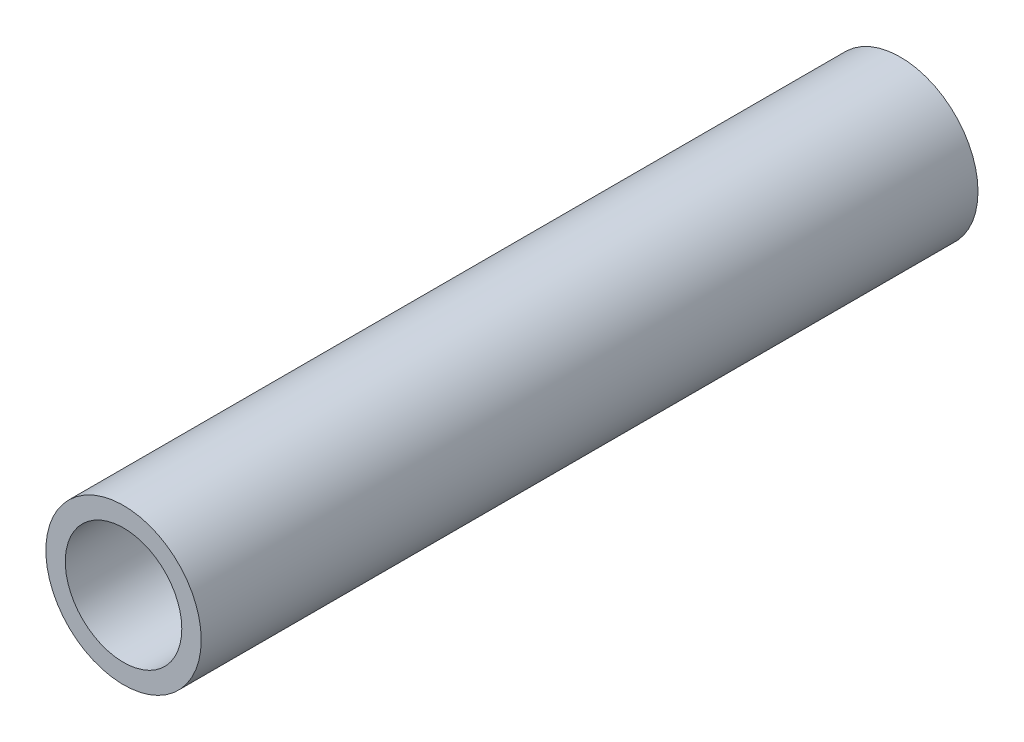
ISO-10303-21;
HEADER;
FILE_DESCRIPTION(('STEP AP214'),'2;1');
FILE_NAME('part.step','',(''),(''),'','','');
FILE_SCHEMA(('AUTOMOTIVE_DESIGN { 1 0 10303 214 1 1 1 1 }'));
ENDSEC;
DATA;
#1=APPLICATION_CONTEXT('core data for automotive mechanical design processes');
#2=APPLICATION_PROTOCOL_DEFINITION('international standard','automotive_design',2000,#1);
#3=PRODUCT_CONTEXT('',#1,'mechanical');
#4=PRODUCT('Part','Part','',(#3));
#5=PRODUCT_RELATED_PRODUCT_CATEGORY('part','',(#4));
#6=PRODUCT_DEFINITION_FORMATION('','',#4);
#7=PRODUCT_DEFINITION_CONTEXT('part definition',#1,'design');
#8=PRODUCT_DEFINITION('design','',#6,#7);
#9=PRODUCT_DEFINITION_SHAPE('','',#8);
#10=(LENGTH_UNIT() NAMED_UNIT(*) SI_UNIT(.MILLI.,.METRE.));
#11=(NAMED_UNIT(*) PLANE_ANGLE_UNIT() SI_UNIT($,.RADIAN.));
#12=(NAMED_UNIT(*) SI_UNIT($,.STERADIAN.) SOLID_ANGLE_UNIT());
#13=UNCERTAINTY_MEASURE_WITH_UNIT(LENGTH_MEASURE(1.E-05),#10,'distance_accuracy_value','');
#14=(GEOMETRIC_REPRESENTATION_CONTEXT(3) GLOBAL_UNCERTAINTY_ASSIGNED_CONTEXT((#13)) GLOBAL_UNIT_ASSIGNED_CONTEXT((#10,
#11,#12)) REPRESENTATION_CONTEXT('',''));
#15=CARTESIAN_POINT('',(0.,0.,0.));
#16=DIRECTION('',(0.,0.,1.));
#17=DIRECTION('',(1.,0.,0.));
#18=AXIS2_PLACEMENT_3D('',#15,#16,#17);
#19=CARTESIAN_POINT('',(0.,0.,40.));
#20=DIRECTION('',(0.,0.,1.));
#21=DIRECTION('',(1.,0.,0.));
#22=AXIS2_PLACEMENT_3D('',#19,#20,#21);
#23=PLANE('',#22);
#24=CARTESIAN_POINT('',(0.,0.,40.));
#25=DIRECTION('',(0.,0.,1.));
#26=DIRECTION('',(1.,0.,0.));
#27=AXIS2_PLACEMENT_3D('',#24,#25,#26);
#28=CIRCLE('',#27,4.);
#29=CARTESIAN_POINT('',(4.,0.,40.));
#30=VERTEX_POINT('',#29);
#31=EDGE_CURVE('E10',#30,#30,#28,.T.);
#32=ORIENTED_EDGE('',*,*,#31,.T.);
#33=EDGE_LOOP('',(#32));
#34=FACE_BOUND('',#33,.T.);
#35=CARTESIAN_POINT('',(0.,0.,40.));
#36=DIRECTION('',(0.,0.,1.));
#37=DIRECTION('',(1.,0.,0.));
#38=AXIS2_PLACEMENT_3D('',#35,#36,#37);
#39=CIRCLE('',#38,3.);
#40=CARTESIAN_POINT('',(3.,0.,40.));
#41=VERTEX_POINT('',#40);
#42=EDGE_CURVE('E43',#41,#41,#39,.T.);
#43=ORIENTED_EDGE('',*,*,#42,.F.);
#44=EDGE_LOOP('',(#43));
#45=FACE_BOUND('',#44,.T.);
#46=ADVANCED_FACE('F32',(#34,#45),#23,.T.);
#47=CARTESIAN_POINT('',(0.,0.,0.));
#48=DIRECTION('',(0.,0.,1.));
#49=DIRECTION('',(1.,0.,0.));
#50=AXIS2_PLACEMENT_3D('',#47,#48,#49);
#51=PLANE('',#50);
#52=CARTESIAN_POINT('',(0.,0.,0.));
#53=DIRECTION('',(0.,0.,1.));
#54=DIRECTION('',(1.,0.,0.));
#55=AXIS2_PLACEMENT_3D('',#52,#53,#54);
#56=CIRCLE('',#55,4.);
#57=CARTESIAN_POINT('',(4.,0.,0.));
#58=VERTEX_POINT('',#57);
#59=EDGE_CURVE('E36',#58,#58,#56,.T.);
#60=ORIENTED_EDGE('',*,*,#59,.F.);
#61=EDGE_LOOP('',(#60));
#62=FACE_BOUND('',#61,.T.);
#63=CARTESIAN_POINT('',(0.,0.,0.));
#64=DIRECTION('',(0.,0.,1.));
#65=DIRECTION('',(1.,0.,0.));
#66=AXIS2_PLACEMENT_3D('',#63,#64,#65);
#67=CIRCLE('',#66,3.);
#68=CARTESIAN_POINT('',(3.,0.,0.));
#69=VERTEX_POINT('',#68);
#70=EDGE_CURVE('E45',#69,#69,#67,.T.);
#71=ORIENTED_EDGE('',*,*,#70,.T.);
#72=EDGE_LOOP('',(#71));
#73=FACE_BOUND('',#72,.T.);
#74=ADVANCED_FACE('F55',(#62,#73),#51,.F.);
#75=CARTESIAN_POINT('',(0.,0.,40.));
#76=DIRECTION('',(0.,0.,-1.));
#77=DIRECTION('',(-1.,0.,0.));
#78=AXIS2_PLACEMENT_3D('',#75,#76,#77);
#79=CYLINDRICAL_SURFACE('',#78,4.);
#80=ORIENTED_EDGE('',*,*,#31,.F.);
#81=EDGE_LOOP('',(#80));
#82=FACE_BOUND('',#81,.T.);
#83=ORIENTED_EDGE('',*,*,#59,.T.);
#84=EDGE_LOOP('',(#83));
#85=FACE_BOUND('',#84,.T.);
#86=ADVANCED_FACE('F34',(#82,#85),#79,.T.);
#87=CARTESIAN_POINT('',(0.,0.,40.));
#88=DIRECTION('',(0.,0.,-1.));
#89=DIRECTION('',(-1.,0.,0.));
#90=AXIS2_PLACEMENT_3D('',#87,#88,#89);
#91=CYLINDRICAL_SURFACE('',#90,3.);
#92=ORIENTED_EDGE('',*,*,#42,.T.);
#93=EDGE_LOOP('',(#92));
#94=FACE_BOUND('',#93,.T.);
#95=ORIENTED_EDGE('',*,*,#70,.F.);
#96=EDGE_LOOP('',(#95));
#97=FACE_BOUND('',#96,.T.);
#98=ADVANCED_FACE('F51',(#94,#97),#91,.F.);
#99=CLOSED_SHELL('',(#46,#74,#86,#98));
#100=MANIFOLD_SOLID_BREP('B2',#99);
#101=ADVANCED_BREP_SHAPE_REPRESENTATION('',(#18,#100),#14);
#102=SHAPE_DEFINITION_REPRESENTATION(#9,#101);
ENDSEC;
END-ISO-10303-21;
